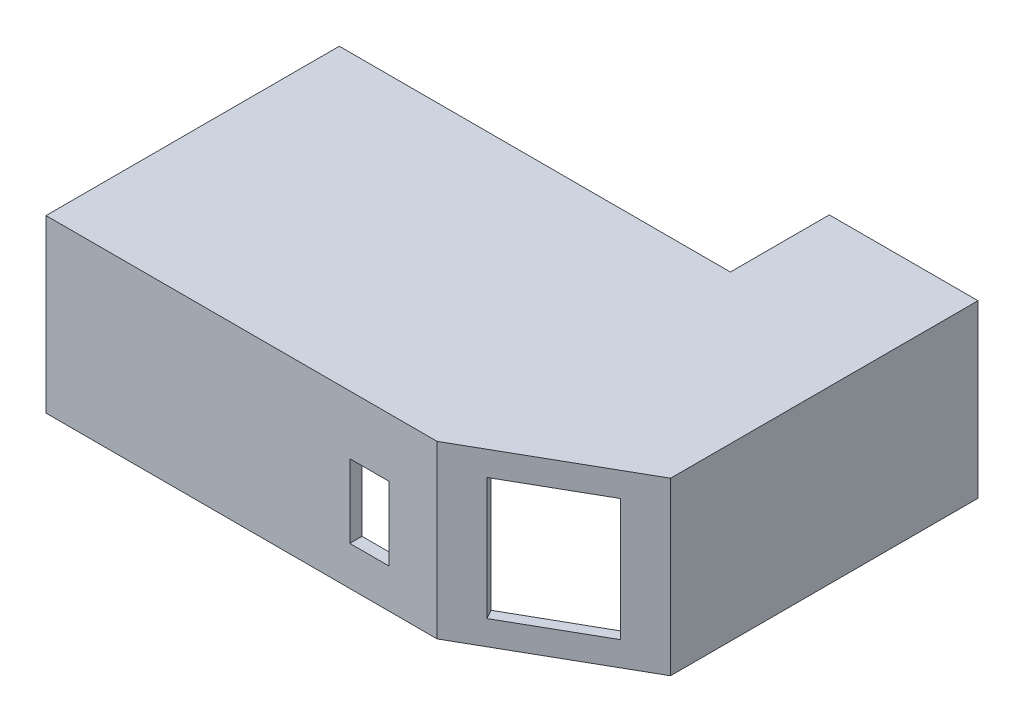
ISO-10303-21;
HEADER;
FILE_DESCRIPTION(('STEP AP214'),'2;1');
FILE_NAME('part.step','',(''),(''),'','','');
FILE_SCHEMA(('AUTOMOTIVE_DESIGN { 1 0 10303 214 1 1 1 1 }'));
ENDSEC;
DATA;
#1=APPLICATION_CONTEXT('core data for automotive mechanical design processes');
#2=APPLICATION_PROTOCOL_DEFINITION('international standard','automotive_design',2000,#1);
#3=PRODUCT_CONTEXT('',#1,'mechanical');
#4=PRODUCT('Part','Part','',(#3));
#5=PRODUCT_RELATED_PRODUCT_CATEGORY('part','',(#4));
#6=PRODUCT_DEFINITION_FORMATION('','',#4);
#7=PRODUCT_DEFINITION_CONTEXT('part definition',#1,'design');
#8=PRODUCT_DEFINITION('design','',#6,#7);
#9=PRODUCT_DEFINITION_SHAPE('','',#8);
#10=(LENGTH_UNIT() NAMED_UNIT(*) SI_UNIT(.MILLI.,.METRE.));
#11=(NAMED_UNIT(*) PLANE_ANGLE_UNIT() SI_UNIT($,.RADIAN.));
#12=(NAMED_UNIT(*) SI_UNIT($,.STERADIAN.) SOLID_ANGLE_UNIT());
#13=UNCERTAINTY_MEASURE_WITH_UNIT(LENGTH_MEASURE(1.E-05),#10,'distance_accuracy_value','');
#14=(GEOMETRIC_REPRESENTATION_CONTEXT(3) GLOBAL_UNCERTAINTY_ASSIGNED_CONTEXT((#13)) GLOBAL_UNIT_ASSIGNED_CONTEXT((#10,
#11,#12)) REPRESENTATION_CONTEXT('',''));
#15=CARTESIAN_POINT('',(0.,0.,0.));
#16=DIRECTION('',(0.,0.,1.));
#17=DIRECTION('',(1.,0.,0.));
#18=AXIS2_PLACEMENT_3D('',#15,#16,#17);
#19=CARTESIAN_POINT('',(0.,35.,0.));
#20=DIRECTION('',(1.,0.,0.));
#21=DIRECTION('',(0.,0.,-1.));
#22=AXIS2_PLACEMENT_3D('',#19,#20,#21);
#23=PLANE('',#22);
#24=DIRECTION('',(0.,0.,1.));
#25=VECTOR('',#24,1.);
#26=CARTESIAN_POINT('',(0.,0.,0.));
#27=LINE('',#26,#25);
#28=CARTESIAN_POINT('',(0.,0.,-60.));
#29=VERTEX_POINT('',#28);
#30=CARTESIAN_POINT('',(0.,0.,0.));
#31=VERTEX_POINT('',#30);
#32=EDGE_CURVE('E308',#29,#31,#27,.T.);
#33=ORIENTED_EDGE('',*,*,#32,.T.);
#34=DIRECTION('',(0.,-1.,0.));
#35=VECTOR('',#34,1.);
#36=CARTESIAN_POINT('',(0.,35.,0.));
#37=LINE('',#36,#35);
#38=CARTESIAN_POINT('',(0.,35.,0.));
#39=VERTEX_POINT('',#38);
#40=EDGE_CURVE('E395',#39,#31,#37,.T.);
#41=ORIENTED_EDGE('',*,*,#40,.F.);
#42=DIRECTION('',(0.,0.,1.));
#43=VECTOR('',#42,1.);
#44=CARTESIAN_POINT('',(0.,35.,0.));
#45=LINE('',#44,#43);
#46=CARTESIAN_POINT('',(0.,35.,-60.));
#47=VERTEX_POINT('',#46);
#48=EDGE_CURVE('E327',#47,#39,#45,.T.);
#49=ORIENTED_EDGE('',*,*,#48,.F.);
#50=DIRECTION('',(0.,-1.,0.));
#51=VECTOR('',#50,1.);
#52=CARTESIAN_POINT('',(0.,35.,-60.));
#53=LINE('',#52,#51);
#54=EDGE_CURVE('E350',#47,#29,#53,.T.);
#55=ORIENTED_EDGE('',*,*,#54,.T.);
#56=EDGE_LOOP('',(#33,#41,#49,#55));
#57=FACE_BOUND('',#56,.T.);
#58=ADVANCED_FACE('F38',(#57),#23,.F.);
#59=CARTESIAN_POINT('',(0.,35.,0.));
#60=DIRECTION('',(0.,0.,-1.));
#61=DIRECTION('',(-1.,0.,0.));
#62=AXIS2_PLACEMENT_3D('',#59,#60,#61);
#63=PLANE('',#62);
#64=DIRECTION('',(1.,0.,0.));
#65=VECTOR('',#64,1.);
#66=CARTESIAN_POINT('',(62.1548724958976,8.,0.));
#67=LINE('',#66,#65);
#68=CARTESIAN_POINT('',(62.1548724958976,8.,0.));
#69=VERTEX_POINT('',#68);
#70=CARTESIAN_POINT('',(70.1548724958976,8.,0.));
#71=VERTEX_POINT('',#70);
#72=EDGE_CURVE('E199',#69,#71,#67,.T.);
#73=ORIENTED_EDGE('',*,*,#72,.F.);
#74=DIRECTION('',(0.,-1.,0.));
#75=VECTOR('',#74,1.);
#76=CARTESIAN_POINT('',(62.1548724958976,23.,0.));
#77=LINE('',#76,#75);
#78=CARTESIAN_POINT('',(62.1548724958976,23.,0.));
#79=VERTEX_POINT('',#78);
#80=EDGE_CURVE('E53',#79,#69,#77,.T.);
#81=ORIENTED_EDGE('',*,*,#80,.F.);
#82=DIRECTION('',(-1.,0.,0.));
#83=VECTOR('',#82,1.);
#84=CARTESIAN_POINT('',(62.1548724958976,23.,0.));
#85=LINE('',#84,#83);
#86=CARTESIAN_POINT('',(70.1548724958976,23.,0.));
#87=VERTEX_POINT('',#86);
#88=EDGE_CURVE('E207',#87,#79,#85,.T.);
#89=ORIENTED_EDGE('',*,*,#88,.F.);
#90=DIRECTION('',(0.,1.,0.));
#91=VECTOR('',#90,1.);
#92=CARTESIAN_POINT('',(70.1548724958976,23.,0.));
#93=LINE('',#92,#91);
#94=EDGE_CURVE('E189',#71,#87,#93,.T.);
#95=ORIENTED_EDGE('',*,*,#94,.F.);
#96=EDGE_LOOP('',(#73,#81,#89,#95));
#97=FACE_BOUND('',#96,.T.);
#98=DIRECTION('',(1.,0.,0.));
#99=VECTOR('',#98,1.);
#100=CARTESIAN_POINT('',(0.,0.,0.));
#101=LINE('',#100,#99);
#102=CARTESIAN_POINT('',(80.,0.,0.));
#103=VERTEX_POINT('',#102);
#104=EDGE_CURVE('E354',#31,#103,#101,.T.);
#105=ORIENTED_EDGE('',*,*,#104,.T.);
#106=DIRECTION('',(0.,-1.,0.));
#107=VECTOR('',#106,1.);
#108=CARTESIAN_POINT('',(80.,35.,0.));
#109=LINE('',#108,#107);
#110=CARTESIAN_POINT('',(80.,35.,0.));
#111=VERTEX_POINT('',#110);
#112=EDGE_CURVE('E391',#111,#103,#109,.T.);
#113=ORIENTED_EDGE('',*,*,#112,.F.);
#114=DIRECTION('',(1.,0.,0.));
#115=VECTOR('',#114,1.);
#116=CARTESIAN_POINT('',(0.,35.,0.));
#117=LINE('',#116,#115);
#118=EDGE_CURVE('E331',#39,#111,#117,.T.);
#119=ORIENTED_EDGE('',*,*,#118,.F.);
#120=ORIENTED_EDGE('',*,*,#40,.T.);
#121=EDGE_LOOP('',(#105,#113,#119,#120));
#122=FACE_BOUND('',#121,.T.);
#123=ADVANCED_FACE('F204',(#97,#122),#63,.F.);
#124=CARTESIAN_POINT('',(80.,35.,0.));
#125=DIRECTION('',(-0.495479383518765,0.,-0.868619698434168));
#126=DIRECTION('',(-0.868619698434168,0.,0.495479383518765));
#127=AXIS2_PLACEMENT_3D('',#124,#125,#126);
#128=PLANE('',#127);
#129=DIRECTION('',(0.868619698434168,0.,-0.495479383518765));
#130=VECTOR('',#129,1.);
#131=CARTESIAN_POINT('',(86.5146477382563,5.,-3.71609537639075));
#132=LINE('',#131,#130);
#133=CARTESIAN_POINT('',(86.5146477382563,5.,-3.71609537639075));
#134=VERTEX_POINT('',#133);
#135=CARTESIAN_POINT('',(103.88704170694,5.,-13.625683046766));
#136=VERTEX_POINT('',#135);
#137=EDGE_CURVE('E229',#134,#136,#132,.T.);
#138=ORIENTED_EDGE('',*,*,#137,.F.);
#139=DIRECTION('',(0.,-1.,0.));
#140=VECTOR('',#139,1.);
#141=CARTESIAN_POINT('',(86.5146477382563,30.,-3.71609537639074));
#142=LINE('',#141,#140);
#143=CARTESIAN_POINT('',(86.5146477382563,30.,-3.71609537639074));
#144=VERTEX_POINT('',#143);
#145=EDGE_CURVE('E226',#144,#134,#142,.T.);
#146=ORIENTED_EDGE('',*,*,#145,.F.);
#147=DIRECTION('',(-0.868619698434168,0.,0.495479383518765));
#148=VECTOR('',#147,1.);
#149=CARTESIAN_POINT('',(86.5146477382563,30.,-3.71609537639074));
#150=LINE('',#149,#148);
#151=CARTESIAN_POINT('',(103.88704170694,30.,-13.625683046766));
#152=VERTEX_POINT('',#151);
#153=EDGE_CURVE('E237',#152,#144,#150,.T.);
#154=ORIENTED_EDGE('',*,*,#153,.F.);
#155=DIRECTION('',(0.,1.,0.));
#156=VECTOR('',#155,1.);
#157=CARTESIAN_POINT('',(103.88704170694,30.,-13.625683046766));
#158=LINE('',#157,#156);
#159=EDGE_CURVE('E233',#136,#152,#158,.T.);
#160=ORIENTED_EDGE('',*,*,#159,.F.);
#161=EDGE_LOOP('',(#138,#146,#154,#160));
#162=FACE_BOUND('',#161,.T.);
#163=DIRECTION('',(0.868619698434168,0.,-0.495479383518765));
#164=VECTOR('',#163,1.);
#165=CARTESIAN_POINT('',(80.,0.,0.));
#166=LINE('',#165,#164);
#167=CARTESIAN_POINT('',(110.413987200093,0.,-17.348793327408));
#168=VERTEX_POINT('',#167);
#169=EDGE_CURVE('E357',#103,#168,#166,.T.);
#170=ORIENTED_EDGE('',*,*,#169,.T.);
#171=DIRECTION('',(0.,-1.,0.));
#172=VECTOR('',#171,1.);
#173=CARTESIAN_POINT('',(110.413987200093,35.,-17.348793327408));
#174=LINE('',#173,#172);
#175=CARTESIAN_POINT('',(110.413987200093,35.,-17.348793327408));
#176=VERTEX_POINT('',#175);
#177=EDGE_CURVE('E387',#176,#168,#174,.T.);
#178=ORIENTED_EDGE('',*,*,#177,.F.);
#179=DIRECTION('',(0.868619698434168,0.,-0.495479383518765));
#180=VECTOR('',#179,1.);
#181=CARTESIAN_POINT('',(80.,35.,0.));
#182=LINE('',#181,#180);
#183=EDGE_CURVE('E335',#111,#176,#182,.T.);
#184=ORIENTED_EDGE('',*,*,#183,.F.);
#185=ORIENTED_EDGE('',*,*,#112,.T.);
#186=EDGE_LOOP('',(#170,#178,#184,#185));
#187=FACE_BOUND('',#186,.T.);
#188=ADVANCED_FACE('F447',(#162,#187),#128,.F.);
#189=CARTESIAN_POINT('',(110.413987200093,35.,-60.));
#190=DIRECTION('',(-1.,0.,0.));
#191=DIRECTION('',(0.,0.,1.));
#192=AXIS2_PLACEMENT_3D('',#189,#190,#191);
#193=PLANE('',#192);
#194=DIRECTION('',(0.,0.,-1.));
#195=VECTOR('',#194,1.);
#196=CARTESIAN_POINT('',(110.413987200093,0.,-60.));
#197=LINE('',#196,#195);
#198=CARTESIAN_POINT('',(110.413987200093,0.,-80.2410231425809));
#199=VERTEX_POINT('',#198);
#200=EDGE_CURVE('E361',#168,#199,#197,.T.);
#201=ORIENTED_EDGE('',*,*,#200,.T.);
#202=DIRECTION('',(0.,-1.,0.));
#203=VECTOR('',#202,1.);
#204=CARTESIAN_POINT('',(110.413987200093,35.,-80.2410231425809));
#205=LINE('',#204,#203);
#206=CARTESIAN_POINT('',(110.413987200093,35.,-80.2410231425809));
#207=VERTEX_POINT('',#206);
#208=EDGE_CURVE('E383',#207,#199,#205,.T.);
#209=ORIENTED_EDGE('',*,*,#208,.F.);
#210=DIRECTION('',(0.,0.,-1.));
#211=VECTOR('',#210,1.);
#212=CARTESIAN_POINT('',(110.413987200093,35.,-17.348793327408));
#213=LINE('',#212,#211);
#214=EDGE_CURVE('E338',#176,#207,#213,.T.);
#215=ORIENTED_EDGE('',*,*,#214,.F.);
#216=ORIENTED_EDGE('',*,*,#177,.T.);
#217=EDGE_LOOP('',(#201,#209,#215,#216));
#218=FACE_BOUND('',#217,.T.);
#219=ADVANCED_FACE('F476',(#218),#193,.F.);
#220=CARTESIAN_POINT('',(110.413987200093,35.,-80.2410231425809));
#221=DIRECTION('',(0.,0.,1.));
#222=DIRECTION('',(1.,0.,0.));
#223=AXIS2_PLACEMENT_3D('',#220,#221,#222);
#224=PLANE('',#223);
#225=CARTESIAN_POINT('',(97.4139872000932,17.5,-80.2410231425809));
#226=DIRECTION('',(0.,0.,-1.));
#227=DIRECTION('',(-1.,0.,0.));
#228=AXIS2_PLACEMENT_3D('',#225,#226,#227);
#229=CIRCLE('',#228,3.50000000000001);
#230=CARTESIAN_POINT('',(93.9139872000932,17.5,-80.2410231425809));
#231=VERTEX_POINT('',#230);
#232=EDGE_CURVE('E217',#231,#231,#229,.T.);
#233=ORIENTED_EDGE('',*,*,#232,.F.);
#234=EDGE_LOOP('',(#233));
#235=FACE_BOUND('',#234,.T.);
#236=DIRECTION('',(-1.,0.,0.));
#237=VECTOR('',#236,1.);
#238=CARTESIAN_POINT('',(110.413987200093,0.,-80.2410231425809));
#239=LINE('',#238,#237);
#240=CARTESIAN_POINT('',(80.,0.,-80.2410231425809));
#241=VERTEX_POINT('',#240);
#242=EDGE_CURVE('E364',#199,#241,#239,.T.);
#243=ORIENTED_EDGE('',*,*,#242,.T.);
#244=DIRECTION('',(0.,-1.,0.));
#245=VECTOR('',#244,1.);
#246=CARTESIAN_POINT('',(80.,35.,-80.2410231425809));
#247=LINE('',#246,#245);
#248=CARTESIAN_POINT('',(80.,35.,-80.2410231425809));
#249=VERTEX_POINT('',#248);
#250=EDGE_CURVE('E379',#249,#241,#247,.T.);
#251=ORIENTED_EDGE('',*,*,#250,.F.);
#252=DIRECTION('',(-1.,0.,0.));
#253=VECTOR('',#252,1.);
#254=CARTESIAN_POINT('',(110.413987200093,35.,-80.2410231425809));
#255=LINE('',#254,#253);
#256=EDGE_CURVE('E341',#207,#249,#255,.T.);
#257=ORIENTED_EDGE('',*,*,#256,.F.);
#258=ORIENTED_EDGE('',*,*,#208,.T.);
#259=EDGE_LOOP('',(#243,#251,#257,#258));
#260=FACE_BOUND('',#259,.T.);
#261=ADVANCED_FACE('F471',(#235,#260),#224,.F.);
#262=CARTESIAN_POINT('',(80.,35.,-80.2410231425809));
#263=DIRECTION('',(1.,0.,0.));
#264=DIRECTION('',(0.,0.,-1.));
#265=AXIS2_PLACEMENT_3D('',#262,#263,#264);
#266=PLANE('',#265);
#267=DIRECTION('',(0.,0.,1.));
#268=VECTOR('',#267,1.);
#269=CARTESIAN_POINT('',(80.,0.,-80.2410231425809));
#270=LINE('',#269,#268);
#271=CARTESIAN_POINT('',(80.,0.,-60.));
#272=VERTEX_POINT('',#271);
#273=EDGE_CURVE('E367',#241,#272,#270,.T.);
#274=ORIENTED_EDGE('',*,*,#273,.T.);
#275=DIRECTION('',(0.,-1.,0.));
#276=VECTOR('',#275,1.);
#277=CARTESIAN_POINT('',(80.,35.,-60.));
#278=LINE('',#277,#276);
#279=CARTESIAN_POINT('',(80.,35.,-60.));
#280=VERTEX_POINT('',#279);
#281=EDGE_CURVE('E375',#280,#272,#278,.T.);
#282=ORIENTED_EDGE('',*,*,#281,.F.);
#283=DIRECTION('',(0.,0.,1.));
#284=VECTOR('',#283,1.);
#285=CARTESIAN_POINT('',(80.,35.,-80.2410231425809));
#286=LINE('',#285,#284);
#287=EDGE_CURVE('E344',#249,#280,#286,.T.);
#288=ORIENTED_EDGE('',*,*,#287,.F.);
#289=ORIENTED_EDGE('',*,*,#250,.T.);
#290=EDGE_LOOP('',(#274,#282,#288,#289));
#291=FACE_BOUND('',#290,.T.);
#292=ADVANCED_FACE('F467',(#291),#266,.F.);
#293=CARTESIAN_POINT('',(0.,35.,-60.));
#294=DIRECTION('',(0.,0.,1.));
#295=DIRECTION('',(1.,0.,0.));
#296=AXIS2_PLACEMENT_3D('',#293,#294,#295);
#297=PLANE('',#296);
#298=DIRECTION('',(-1.,0.,0.));
#299=VECTOR('',#298,1.);
#300=CARTESIAN_POINT('',(0.,0.,-60.));
#301=LINE('',#300,#299);
#302=EDGE_CURVE('E332',#272,#29,#301,.T.);
#303=ORIENTED_EDGE('',*,*,#302,.T.);
#304=ORIENTED_EDGE('',*,*,#54,.F.);
#305=DIRECTION('',(-1.,0.,0.));
#306=VECTOR('',#305,1.);
#307=CARTESIAN_POINT('',(0.,35.,-60.));
#308=LINE('',#307,#306);
#309=EDGE_CURVE('E347',#280,#47,#308,.T.);
#310=ORIENTED_EDGE('',*,*,#309,.F.);
#311=ORIENTED_EDGE('',*,*,#281,.T.);
#312=EDGE_LOOP('',(#303,#304,#310,#311));
#313=FACE_BOUND('',#312,.T.);
#314=ADVANCED_FACE('F465',(#313),#297,.F.);
#315=CARTESIAN_POINT('',(0.,35.,0.));
#316=DIRECTION('',(0.,-1.,0.));
#317=DIRECTION('',(0.,0.,-1.));
#318=AXIS2_PLACEMENT_3D('',#315,#316,#317);
#319=PLANE('',#318);
#320=ORIENTED_EDGE('',*,*,#48,.T.);
#321=ORIENTED_EDGE('',*,*,#118,.T.);
#322=ORIENTED_EDGE('',*,*,#183,.T.);
#323=ORIENTED_EDGE('',*,*,#214,.T.);
#324=ORIENTED_EDGE('',*,*,#256,.T.);
#325=ORIENTED_EDGE('',*,*,#287,.T.);
#326=ORIENTED_EDGE('',*,*,#309,.T.);
#327=EDGE_LOOP('',(#320,#321,#322,#323,#324,#325,#326));
#328=FACE_BOUND('',#327,.T.);
#329=ADVANCED_FACE('F460',(#328),#319,.F.);
#330=CARTESIAN_POINT('',(0.,0.,0.));
#331=DIRECTION('',(0.,-1.,0.));
#332=DIRECTION('',(0.,0.,-1.));
#333=AXIS2_PLACEMENT_3D('',#330,#331,#332);
#334=PLANE('',#333);
#335=DIRECTION('',(0.,0.,-1.));
#336=VECTOR('',#335,1.);
#337=CARTESIAN_POINT('',(2.5,0.,-2.5));
#338=LINE('',#337,#336);
#339=CARTESIAN_POINT('',(2.5,0.,-2.5));
#340=VERTEX_POINT('',#339);
#341=CARTESIAN_POINT('',(2.5,0.,-57.5));
#342=VERTEX_POINT('',#341);
#343=EDGE_CURVE('E245',#340,#342,#338,.T.);
#344=ORIENTED_EDGE('',*,*,#343,.F.);
#345=DIRECTION('',(1.,0.,0.));
#346=VECTOR('',#345,1.);
#347=CARTESIAN_POINT('',(2.5,0.,-2.5));
#348=LINE('',#347,#346);
#349=CARTESIAN_POINT('',(80.,0.,-2.49999999999999));
#350=VERTEX_POINT('',#349);
#351=EDGE_CURVE('E260',#340,#350,#348,.T.);
#352=ORIENTED_EDGE('',*,*,#351,.T.);
#353=DIRECTION('',(0.869644648573949,0.,-0.493678220308222));
#354=VECTOR('',#353,1.);
#355=CARTESIAN_POINT('',(80.,0.,-2.49999999999999));
#356=LINE('',#355,#354);
#357=CARTESIAN_POINT('',(107.913987200093,0.,-18.346159170008));
#358=VERTEX_POINT('',#357);
#359=EDGE_CURVE('E298',#350,#358,#356,.T.);
#360=ORIENTED_EDGE('',*,*,#359,.T.);
#361=DIRECTION('',(0.,0.,-1.));
#362=VECTOR('',#361,1.);
#363=CARTESIAN_POINT('',(107.913987200093,0.,-18.346159170008));
#364=LINE('',#363,#362);
#365=CARTESIAN_POINT('',(107.913987200093,0.,-77.7410231425809));
#366=VERTEX_POINT('',#365);
#367=EDGE_CURVE('E294',#358,#366,#364,.T.);
#368=ORIENTED_EDGE('',*,*,#367,.T.);
#369=DIRECTION('',(-1.,0.,0.));
#370=VECTOR('',#369,1.);
#371=CARTESIAN_POINT('',(107.913987200093,0.,-77.7410231425809));
#372=LINE('',#371,#370);
#373=CARTESIAN_POINT('',(82.5,0.,-77.7410231425809));
#374=VERTEX_POINT('',#373);
#375=EDGE_CURVE('E290',#366,#374,#372,.T.);
#376=ORIENTED_EDGE('',*,*,#375,.T.);
#377=DIRECTION('',(0.,0.,1.));
#378=VECTOR('',#377,1.);
#379=CARTESIAN_POINT('',(82.5,0.,-77.7410231425809));
#380=LINE('',#379,#378);
#381=CARTESIAN_POINT('',(82.5,0.,-57.5));
#382=VERTEX_POINT('',#381);
#383=EDGE_CURVE('E286',#374,#382,#380,.T.);
#384=ORIENTED_EDGE('',*,*,#383,.T.);
#385=DIRECTION('',(-1.,0.,0.));
#386=VECTOR('',#385,1.);
#387=CARTESIAN_POINT('',(82.5,0.,-57.5));
#388=LINE('',#387,#386);
#389=EDGE_CURVE('E282',#382,#342,#388,.T.);
#390=ORIENTED_EDGE('',*,*,#389,.T.);
#391=EDGE_LOOP('',(#344,#352,#360,#368,#376,#384,#390));
#392=FACE_BOUND('',#391,.T.);
#393=ORIENTED_EDGE('',*,*,#32,.F.);
#394=ORIENTED_EDGE('',*,*,#302,.F.);
#395=ORIENTED_EDGE('',*,*,#273,.F.);
#396=ORIENTED_EDGE('',*,*,#242,.F.);
#397=ORIENTED_EDGE('',*,*,#200,.F.);
#398=ORIENTED_EDGE('',*,*,#169,.F.);
#399=ORIENTED_EDGE('',*,*,#104,.F.);
#400=EDGE_LOOP('',(#393,#394,#395,#396,#397,#398,#399));
#401=FACE_BOUND('',#400,.T.);
#402=ADVANCED_FACE('F454',(#392,#401),#334,.T.);
#403=CARTESIAN_POINT('',(2.5,32.5,-2.5));
#404=DIRECTION('',(-1.,0.,0.));
#405=DIRECTION('',(0.,0.,1.));
#406=AXIS2_PLACEMENT_3D('',#403,#404,#405);
#407=PLANE('',#406);
#408=ORIENTED_EDGE('',*,*,#343,.T.);
#409=DIRECTION('',(0.,-1.,0.));
#410=VECTOR('',#409,1.);
#411=CARTESIAN_POINT('',(2.5,32.5,-57.5));
#412=LINE('',#411,#410);
#413=CARTESIAN_POINT('',(2.5,32.5,-57.5));
#414=VERTEX_POINT('',#413);
#415=EDGE_CURVE('E279',#414,#342,#412,.T.);
#416=ORIENTED_EDGE('',*,*,#415,.F.);
#417=DIRECTION('',(0.,0.,-1.));
#418=VECTOR('',#417,1.);
#419=CARTESIAN_POINT('',(2.5,32.5,-2.5));
#420=LINE('',#419,#418);
#421=CARTESIAN_POINT('',(2.5,32.5,-2.5));
#422=VERTEX_POINT('',#421);
#423=EDGE_CURVE('E255',#422,#414,#420,.T.);
#424=ORIENTED_EDGE('',*,*,#423,.F.);
#425=DIRECTION('',(0.,-1.,0.));
#426=VECTOR('',#425,1.);
#427=CARTESIAN_POINT('',(2.5,32.5,-2.5));
#428=LINE('',#427,#426);
#429=EDGE_CURVE('E305',#422,#340,#428,.T.);
#430=ORIENTED_EDGE('',*,*,#429,.T.);
#431=EDGE_LOOP('',(#408,#416,#424,#430));
#432=FACE_BOUND('',#431,.T.);
#433=ADVANCED_FACE('F497',(#432),#407,.F.);
#434=CARTESIAN_POINT('',(2.5,32.5,-2.5));
#435=DIRECTION('',(0.,0.,-1.));
#436=DIRECTION('',(-1.,0.,0.));
#437=AXIS2_PLACEMENT_3D('',#434,#435,#436);
#438=PLANE('',#437);
#439=DIRECTION('',(0.,1.,0.));
#440=VECTOR('',#439,1.);
#441=CARTESIAN_POINT('',(62.1548724958976,32.5,-2.49999999999999));
#442=LINE('',#441,#440);
#443=CARTESIAN_POINT('',(62.1548724958976,8.,-2.5));
#444=VERTEX_POINT('',#443);
#445=CARTESIAN_POINT('',(62.1548724958976,23.,-2.5));
#446=VERTEX_POINT('',#445);
#447=EDGE_CURVE('E11',#444,#446,#442,.T.);
#448=ORIENTED_EDGE('',*,*,#447,.F.);
#449=DIRECTION('',(-1.,0.,0.));
#450=VECTOR('',#449,1.);
#451=CARTESIAN_POINT('',(2.5,8.,-2.5));
#452=LINE('',#451,#450);
#453=CARTESIAN_POINT('',(70.1548724958976,8.,-2.49999999999999));
#454=VERTEX_POINT('',#453);
#455=EDGE_CURVE('E412',#454,#444,#452,.T.);
#456=ORIENTED_EDGE('',*,*,#455,.F.);
#457=DIRECTION('',(0.,-1.,0.));
#458=VECTOR('',#457,1.);
#459=CARTESIAN_POINT('',(70.1548724958976,32.5,-2.49999999999999));
#460=LINE('',#459,#458);
#461=CARTESIAN_POINT('',(70.1548724958976,23.,-2.5));
#462=VERTEX_POINT('',#461);
#463=EDGE_CURVE('E192',#462,#454,#460,.T.);
#464=ORIENTED_EDGE('',*,*,#463,.F.);
#465=DIRECTION('',(1.,0.,0.));
#466=VECTOR('',#465,1.);
#467=CARTESIAN_POINT('',(2.5,23.,-2.5));
#468=LINE('',#467,#466);
#469=EDGE_CURVE('E46',#446,#462,#468,.T.);
#470=ORIENTED_EDGE('',*,*,#469,.F.);
#471=EDGE_LOOP('',(#448,#456,#464,#470));
#472=FACE_BOUND('',#471,.T.);
#473=ORIENTED_EDGE('',*,*,#351,.F.);
#474=ORIENTED_EDGE('',*,*,#429,.F.);
#475=DIRECTION('',(1.,0.,0.));
#476=VECTOR('',#475,1.);
#477=CARTESIAN_POINT('',(2.5,32.5,-2.5));
#478=LINE('',#477,#476);
#479=CARTESIAN_POINT('',(80.,32.5,-2.49999999999999));
#480=VERTEX_POINT('',#479);
#481=EDGE_CURVE('E276',#422,#480,#478,.T.);
#482=ORIENTED_EDGE('',*,*,#481,.T.);
#483=DIRECTION('',(0.,-1.,0.));
#484=VECTOR('',#483,1.);
#485=CARTESIAN_POINT('',(80.,32.5,-2.49999999999999));
#486=LINE('',#485,#484);
#487=EDGE_CURVE('E309',#480,#350,#486,.T.);
#488=ORIENTED_EDGE('',*,*,#487,.T.);
#489=EDGE_LOOP('',(#473,#474,#482,#488));
#490=FACE_BOUND('',#489,.T.);
#491=ADVANCED_FACE('F426',(#472,#490),#438,.T.);
#492=CARTESIAN_POINT('',(80.,32.5,-2.49999999999999));
#493=DIRECTION('',(-0.493678220308222,0.,-0.869644648573949));
#494=DIRECTION('',(-0.869644648573949,0.,0.493678220308222));
#495=AXIS2_PLACEMENT_3D('',#492,#493,#494);
#496=PLANE('',#495);
#497=DIRECTION('',(0.,1.,0.));
#498=VECTOR('',#497,1.);
#499=CARTESIAN_POINT('',(85.4451190710234,32.5,-5.5910748393119));
#500=LINE('',#499,#498);
#501=CARTESIAN_POINT('',(85.4451190710234,5.,-5.5910748393119));
#502=VERTEX_POINT('',#501);
#503=CARTESIAN_POINT('',(85.4451190710234,30.,-5.5910748393119));
#504=VERTEX_POINT('',#503);
#505=EDGE_CURVE('E409',#502,#504,#500,.T.);
#506=ORIENTED_EDGE('',*,*,#505,.F.);
#507=DIRECTION('',(-0.869644648573949,0.,0.493678220308222));
#508=VECTOR('',#507,1.);
#509=CARTESIAN_POINT('',(80.,5.,-2.49999999999999));
#510=LINE('',#509,#508);
#511=CARTESIAN_POINT('',(102.838049391313,5.,-15.4646604475782));
#512=VERTEX_POINT('',#511);
#513=EDGE_CURVE('E399',#512,#502,#510,.T.);
#514=ORIENTED_EDGE('',*,*,#513,.F.);
#515=DIRECTION('',(0.,-1.,0.));
#516=VECTOR('',#515,1.);
#517=CARTESIAN_POINT('',(102.838049391313,32.5,-15.4646604475782));
#518=LINE('',#517,#516);
#519=CARTESIAN_POINT('',(102.838049391313,30.,-15.4646604475782));
#520=VERTEX_POINT('',#519);
#521=EDGE_CURVE('E402',#520,#512,#518,.T.);
#522=ORIENTED_EDGE('',*,*,#521,.F.);
#523=DIRECTION('',(0.869644648573949,0.,-0.493678220308222));
#524=VECTOR('',#523,1.);
#525=CARTESIAN_POINT('',(80.,30.,-2.49999999999999));
#526=LINE('',#525,#524);
#527=EDGE_CURVE('E406',#504,#520,#526,.T.);
#528=ORIENTED_EDGE('',*,*,#527,.F.);
#529=EDGE_LOOP('',(#506,#514,#522,#528));
#530=FACE_BOUND('',#529,.T.);
#531=ORIENTED_EDGE('',*,*,#359,.F.);
#532=ORIENTED_EDGE('',*,*,#487,.F.);
#533=DIRECTION('',(0.869644648573949,0.,-0.493678220308222));
#534=VECTOR('',#533,1.);
#535=CARTESIAN_POINT('',(80.,32.5,-2.49999999999999));
#536=LINE('',#535,#534);
#537=CARTESIAN_POINT('',(107.913987200093,32.5,-18.346159170008));
#538=VERTEX_POINT('',#537);
#539=EDGE_CURVE('E273',#480,#538,#536,.T.);
#540=ORIENTED_EDGE('',*,*,#539,.T.);
#541=DIRECTION('',(0.,-1.,0.));
#542=VECTOR('',#541,1.);
#543=CARTESIAN_POINT('',(107.913987200093,32.5,-18.346159170008));
#544=LINE('',#543,#542);
#545=EDGE_CURVE('E312',#538,#358,#544,.T.);
#546=ORIENTED_EDGE('',*,*,#545,.T.);
#547=EDGE_LOOP('',(#531,#532,#540,#546));
#548=FACE_BOUND('',#547,.T.);
#549=ADVANCED_FACE('F520',(#530,#548),#496,.T.);
#550=CARTESIAN_POINT('',(107.913987200093,32.5,-18.346159170008));
#551=DIRECTION('',(-1.,0.,0.));
#552=DIRECTION('',(0.,0.,1.));
#553=AXIS2_PLACEMENT_3D('',#550,#551,#552);
#554=PLANE('',#553);
#555=ORIENTED_EDGE('',*,*,#367,.F.);
#556=ORIENTED_EDGE('',*,*,#545,.F.);
#557=DIRECTION('',(0.,0.,-1.));
#558=VECTOR('',#557,1.);
#559=CARTESIAN_POINT('',(107.913987200093,32.5,-18.346159170008));
#560=LINE('',#559,#558);
#561=CARTESIAN_POINT('',(107.913987200093,32.5,-77.7410231425809));
#562=VERTEX_POINT('',#561);
#563=EDGE_CURVE('E270',#538,#562,#560,.T.);
#564=ORIENTED_EDGE('',*,*,#563,.T.);
#565=DIRECTION('',(0.,-1.,0.));
#566=VECTOR('',#565,1.);
#567=CARTESIAN_POINT('',(107.913987200093,32.5,-77.7410231425809));
#568=LINE('',#567,#566);
#569=EDGE_CURVE('E315',#562,#366,#568,.T.);
#570=ORIENTED_EDGE('',*,*,#569,.T.);
#571=EDGE_LOOP('',(#555,#556,#564,#570));
#572=FACE_BOUND('',#571,.T.);
#573=ADVANCED_FACE('F516',(#572),#554,.T.);
#574=CARTESIAN_POINT('',(107.913987200093,32.5,-77.7410231425809));
#575=DIRECTION('',(0.,0.,1.));
#576=DIRECTION('',(1.,0.,0.));
#577=AXIS2_PLACEMENT_3D('',#574,#575,#576);
#578=PLANE('',#577);
#579=CARTESIAN_POINT('',(97.4139872000932,17.5,-77.7410231425809));
#580=DIRECTION('',(0.,0.,1.));
#581=DIRECTION('',(1.,0.,0.));
#582=AXIS2_PLACEMENT_3D('',#579,#580,#581);
#583=CIRCLE('',#582,3.50000000000001);
#584=CARTESIAN_POINT('',(93.9139872000932,17.5,-77.7410231425809));
#585=VERTEX_POINT('',#584);
#586=EDGE_CURVE('E225',#585,#585,#583,.T.);
#587=ORIENTED_EDGE('',*,*,#586,.F.);
#588=EDGE_LOOP('',(#587));
#589=FACE_BOUND('',#588,.T.);
#590=ORIENTED_EDGE('',*,*,#375,.F.);
#591=ORIENTED_EDGE('',*,*,#569,.F.);
#592=DIRECTION('',(-1.,0.,0.));
#593=VECTOR('',#592,1.);
#594=CARTESIAN_POINT('',(107.913987200093,32.5,-77.7410231425809));
#595=LINE('',#594,#593);
#596=CARTESIAN_POINT('',(82.5,32.5,-77.7410231425809));
#597=VERTEX_POINT('',#596);
#598=EDGE_CURVE('E267',#562,#597,#595,.T.);
#599=ORIENTED_EDGE('',*,*,#598,.T.);
#600=DIRECTION('',(0.,-1.,0.));
#601=VECTOR('',#600,1.);
#602=CARTESIAN_POINT('',(82.5,32.5,-77.7410231425809));
#603=LINE('',#602,#601);
#604=EDGE_CURVE('E318',#597,#374,#603,.T.);
#605=ORIENTED_EDGE('',*,*,#604,.T.);
#606=EDGE_LOOP('',(#590,#591,#599,#605));
#607=FACE_BOUND('',#606,.T.);
#608=ADVANCED_FACE('F512',(#589,#607),#578,.T.);
#609=CARTESIAN_POINT('',(82.5,32.5,-77.7410231425809));
#610=DIRECTION('',(1.,0.,0.));
#611=DIRECTION('',(0.,0.,-1.));
#612=AXIS2_PLACEMENT_3D('',#609,#610,#611);
#613=PLANE('',#612);
#614=ORIENTED_EDGE('',*,*,#383,.F.);
#615=ORIENTED_EDGE('',*,*,#604,.F.);
#616=DIRECTION('',(0.,0.,1.));
#617=VECTOR('',#616,1.);
#618=CARTESIAN_POINT('',(82.5,32.5,-77.7410231425809));
#619=LINE('',#618,#617);
#620=CARTESIAN_POINT('',(82.5,32.5,-57.5));
#621=VERTEX_POINT('',#620);
#622=EDGE_CURVE('E263',#597,#621,#619,.T.);
#623=ORIENTED_EDGE('',*,*,#622,.T.);
#624=DIRECTION('',(0.,-1.,0.));
#625=VECTOR('',#624,1.);
#626=CARTESIAN_POINT('',(82.5,32.5,-57.5));
#627=LINE('',#626,#625);
#628=EDGE_CURVE('E321',#621,#382,#627,.T.);
#629=ORIENTED_EDGE('',*,*,#628,.T.);
#630=EDGE_LOOP('',(#614,#615,#623,#629));
#631=FACE_BOUND('',#630,.T.);
#632=ADVANCED_FACE('F508',(#631),#613,.T.);
#633=CARTESIAN_POINT('',(82.5,32.5,-57.5));
#634=DIRECTION('',(0.,0.,1.));
#635=DIRECTION('',(1.,0.,0.));
#636=AXIS2_PLACEMENT_3D('',#633,#634,#635);
#637=PLANE('',#636);
#638=ORIENTED_EDGE('',*,*,#389,.F.);
#639=ORIENTED_EDGE('',*,*,#628,.F.);
#640=DIRECTION('',(1.,0.,0.));
#641=VECTOR('',#640,1.);
#642=CARTESIAN_POINT('',(2.5,32.5,-57.5));
#643=LINE('',#642,#641);
#644=EDGE_CURVE('E259',#414,#621,#643,.T.);
#645=ORIENTED_EDGE('',*,*,#644,.F.);
#646=ORIENTED_EDGE('',*,*,#415,.T.);
#647=EDGE_LOOP('',(#638,#639,#645,#646));
#648=FACE_BOUND('',#647,.T.);
#649=ADVANCED_FACE('F504',(#648),#637,.T.);
#650=CARTESIAN_POINT('',(0.,32.5,0.));
#651=DIRECTION('',(0.,-1.,0.));
#652=DIRECTION('',(0.,0.,-1.));
#653=AXIS2_PLACEMENT_3D('',#650,#651,#652);
#654=PLANE('',#653);
#655=ORIENTED_EDGE('',*,*,#423,.T.);
#656=ORIENTED_EDGE('',*,*,#644,.T.);
#657=ORIENTED_EDGE('',*,*,#622,.F.);
#658=ORIENTED_EDGE('',*,*,#598,.F.);
#659=ORIENTED_EDGE('',*,*,#563,.F.);
#660=ORIENTED_EDGE('',*,*,#539,.F.);
#661=ORIENTED_EDGE('',*,*,#481,.F.);
#662=EDGE_LOOP('',(#655,#656,#657,#658,#659,#660,#661));
#663=FACE_BOUND('',#662,.T.);
#664=ADVANCED_FACE('F507',(#663),#654,.T.);
#665=CARTESIAN_POINT('',(80.3211554442717,30.,-14.5738416068178));
#666=DIRECTION('',(-0.868619698434168,0.,0.495479383518765));
#667=DIRECTION('',(0.495479383518765,0.,0.868619698434168));
#668=AXIS2_PLACEMENT_3D('',#665,#666,#667);
#669=PLANE('',#668);
#670=ORIENTED_EDGE('',*,*,#505,.T.);
#671=DIRECTION('',(0.495479383518765,0.,0.868619698434168));
#672=VECTOR('',#671,1.);
#673=CARTESIAN_POINT('',(80.3211554442717,30.,-14.5738416068178));
#674=LINE('',#673,#672);
#675=EDGE_CURVE('E242',#504,#144,#674,.T.);
#676=ORIENTED_EDGE('',*,*,#675,.T.);
#677=ORIENTED_EDGE('',*,*,#145,.T.);
#678=DIRECTION('',(0.495479383518765,0.,0.868619698434168));
#679=VECTOR('',#678,1.);
#680=CARTESIAN_POINT('',(80.3211554442717,5.,-14.5738416068178));
#681=LINE('',#680,#679);
#682=EDGE_CURVE('E241',#502,#134,#681,.T.);
#683=ORIENTED_EDGE('',*,*,#682,.F.);
#684=EDGE_LOOP('',(#670,#676,#677,#683));
#685=FACE_BOUND('',#684,.T.);
#686=ADVANCED_FACE('F529',(#685),#669,.F.);
#687=CARTESIAN_POINT('',(80.3211554442717,30.,-14.5738416068178));
#688=DIRECTION('',(0.,1.,0.));
#689=DIRECTION('',(0.,0.,1.));
#690=AXIS2_PLACEMENT_3D('',#687,#688,#689);
#691=PLANE('',#690);
#692=ORIENTED_EDGE('',*,*,#527,.T.);
#693=DIRECTION('',(0.495479383518765,0.,0.868619698434168));
#694=VECTOR('',#693,1.);
#695=CARTESIAN_POINT('',(97.6935494129551,30.,-24.4834292771931));
#696=LINE('',#695,#694);
#697=EDGE_CURVE('E246',#520,#152,#696,.T.);
#698=ORIENTED_EDGE('',*,*,#697,.T.);
#699=ORIENTED_EDGE('',*,*,#153,.T.);
#700=ORIENTED_EDGE('',*,*,#675,.F.);
#701=EDGE_LOOP('',(#692,#698,#699,#700));
#702=FACE_BOUND('',#701,.T.);
#703=ADVANCED_FACE('F533',(#702),#691,.F.);
#704=CARTESIAN_POINT('',(97.6935494129551,30.,-24.4834292771931));
#705=DIRECTION('',(0.868619698434168,0.,-0.495479383518765));
#706=DIRECTION('',(-0.495479383518765,0.,-0.868619698434168));
#707=AXIS2_PLACEMENT_3D('',#704,#705,#706);
#708=PLANE('',#707);
#709=ORIENTED_EDGE('',*,*,#521,.T.);
#710=DIRECTION('',(0.495479383518765,0.,0.868619698434168));
#711=VECTOR('',#710,1.);
#712=CARTESIAN_POINT('',(97.6935494129551,5.,-24.4834292771931));
#713=LINE('',#712,#711);
#714=EDGE_CURVE('E249',#512,#136,#713,.T.);
#715=ORIENTED_EDGE('',*,*,#714,.T.);
#716=ORIENTED_EDGE('',*,*,#159,.T.);
#717=ORIENTED_EDGE('',*,*,#697,.F.);
#718=EDGE_LOOP('',(#709,#715,#716,#717));
#719=FACE_BOUND('',#718,.T.);
#720=ADVANCED_FACE('F537',(#719),#708,.F.);
#721=CARTESIAN_POINT('',(80.3211554442717,5.,-14.5738416068178));
#722=DIRECTION('',(0.,-1.,0.));
#723=DIRECTION('',(1.,0.,0.));
#724=AXIS2_PLACEMENT_3D('',#721,#722,#723);
#725=PLANE('',#724);
#726=ORIENTED_EDGE('',*,*,#513,.T.);
#727=ORIENTED_EDGE('',*,*,#682,.T.);
#728=ORIENTED_EDGE('',*,*,#137,.T.);
#729=ORIENTED_EDGE('',*,*,#714,.F.);
#730=EDGE_LOOP('',(#726,#727,#728,#729));
#731=FACE_BOUND('',#730,.T.);
#732=ADVANCED_FACE('F438',(#731),#725,.F.);
#733=CARTESIAN_POINT('',(97.4139872000932,17.5,-67.7410231425809));
#734=DIRECTION('',(0.,0.,-1.));
#735=DIRECTION('',(-1.,0.,0.));
#736=AXIS2_PLACEMENT_3D('',#733,#734,#735);
#737=CYLINDRICAL_SURFACE('',#736,3.50000000000001);
#738=CARTESIAN_POINT('',(93.9139872000932,17.5,-77.7410231425809));
#739=CARTESIAN_POINT('',(93.9139872000932,17.5,-77.7670648092476));
#740=CARTESIAN_POINT('',(93.9139872000932,17.5,-77.7931064759143));
#741=CARTESIAN_POINT('',(93.9139872000932,17.5,-77.8451898092476));
#742=CARTESIAN_POINT('',(93.9139872000932,17.5,-77.8712314759143));
#743=CARTESIAN_POINT('',(93.9139872000932,17.5,-77.9233148092476));
#744=CARTESIAN_POINT('',(93.9139872000932,17.5,-77.9493564759143));
#745=CARTESIAN_POINT('',(93.9139872000932,17.5,-78.0014398092476));
#746=CARTESIAN_POINT('',(93.9139872000932,17.5,-78.0274814759143));
#747=CARTESIAN_POINT('',(93.9139872000932,17.5,-78.0795648092476));
#748=CARTESIAN_POINT('',(93.9139872000932,17.5,-78.1056064759143));
#749=CARTESIAN_POINT('',(93.9139872000932,17.5,-78.1576898092476));
#750=CARTESIAN_POINT('',(93.9139872000932,17.5,-78.1837314759143));
#751=CARTESIAN_POINT('',(93.9139872000932,17.5,-78.2358148092476));
#752=CARTESIAN_POINT('',(93.9139872000932,17.5,-78.2618564759143));
#753=CARTESIAN_POINT('',(93.9139872000932,17.5,-78.3139398092476));
#754=CARTESIAN_POINT('',(93.9139872000932,17.5,-78.3399814759143));
#755=CARTESIAN_POINT('',(93.9139872000932,17.5,-78.3920648092476));
#756=CARTESIAN_POINT('',(93.9139872000932,17.5,-78.4181064759143));
#757=CARTESIAN_POINT('',(93.9139872000932,17.5,-78.4701898092476));
#758=CARTESIAN_POINT('',(93.9139872000932,17.5,-78.4962314759143));
#759=CARTESIAN_POINT('',(93.9139872000932,17.5,-78.5483148092476));
#760=CARTESIAN_POINT('',(93.9139872000932,17.5,-78.5743564759143));
#761=CARTESIAN_POINT('',(93.9139872000932,17.5,-78.6264398092476));
#762=CARTESIAN_POINT('',(93.9139872000932,17.5,-78.6524814759143));
#763=CARTESIAN_POINT('',(93.9139872000932,17.5,-78.7045648092476));
#764=CARTESIAN_POINT('',(93.9139872000932,17.5,-78.7306064759143));
#765=CARTESIAN_POINT('',(93.9139872000932,17.5,-78.7826898092476));
#766=CARTESIAN_POINT('',(93.9139872000932,17.5,-78.8087314759143));
#767=CARTESIAN_POINT('',(93.9139872000932,17.5,-78.8608148092476));
#768=CARTESIAN_POINT('',(93.9139872000932,17.5,-78.8868564759143));
#769=CARTESIAN_POINT('',(93.9139872000932,17.5,-78.9389398092476));
#770=CARTESIAN_POINT('',(93.9139872000932,17.5,-78.9649814759143));
#771=CARTESIAN_POINT('',(93.9139872000932,17.5,-79.0170648092476));
#772=CARTESIAN_POINT('',(93.9139872000932,17.5,-79.0431064759143));
#773=CARTESIAN_POINT('',(93.9139872000932,17.5,-79.0951898092476));
#774=CARTESIAN_POINT('',(93.9139872000932,17.5,-79.1212314759143));
#775=CARTESIAN_POINT('',(93.9139872000932,17.5,-79.1733148092476));
#776=CARTESIAN_POINT('',(93.9139872000932,17.5,-79.1993564759143));
#777=CARTESIAN_POINT('',(93.9139872000932,17.5,-79.2514398092476));
#778=CARTESIAN_POINT('',(93.9139872000932,17.5,-79.2774814759142));
#779=CARTESIAN_POINT('',(93.9139872000932,17.5,-79.3295648092476));
#780=CARTESIAN_POINT('',(93.9139872000932,17.5,-79.3556064759142));
#781=CARTESIAN_POINT('',(93.9139872000932,17.5,-79.4076898092476));
#782=CARTESIAN_POINT('',(93.9139872000932,17.5,-79.4337314759143));
#783=CARTESIAN_POINT('',(93.9139872000932,17.5,-79.4858148092476));
#784=CARTESIAN_POINT('',(93.9139872000932,17.5,-79.5118564759143));
#785=CARTESIAN_POINT('',(93.9139872000932,17.5,-79.5639398092476));
#786=CARTESIAN_POINT('',(93.9139872000932,17.5,-79.5899814759143));
#787=CARTESIAN_POINT('',(93.9139872000932,17.5,-79.6420648092476));
#788=CARTESIAN_POINT('',(93.9139872000932,17.5,-79.6681064759143));
#789=CARTESIAN_POINT('',(93.9139872000932,17.5,-79.7201898092476));
#790=CARTESIAN_POINT('',(93.9139872000932,17.5,-79.7462314759143));
#791=CARTESIAN_POINT('',(93.9139872000932,17.5,-79.7983148092476));
#792=CARTESIAN_POINT('',(93.9139872000932,17.5,-79.8243564759143));
#793=CARTESIAN_POINT('',(93.9139872000932,17.5,-79.8764398092476));
#794=CARTESIAN_POINT('',(93.9139872000932,17.5,-79.9024814759142));
#795=CARTESIAN_POINT('',(93.9139872000932,17.5,-79.9545648092476));
#796=CARTESIAN_POINT('',(93.9139872000932,17.5,-79.9806064759142));
#797=CARTESIAN_POINT('',(93.9139872000932,17.5,-80.0326898092476));
#798=CARTESIAN_POINT('',(93.9139872000932,17.5,-80.0587314759142));
#799=CARTESIAN_POINT('',(93.9139872000932,17.5,-80.1108148092476));
#800=CARTESIAN_POINT('',(93.9139872000932,17.5,-80.1368564759143));
#801=CARTESIAN_POINT('',(93.9139872000932,17.5,-80.1889398092476));
#802=CARTESIAN_POINT('',(93.9139872000932,17.5,-80.2149814759143));
#803=CARTESIAN_POINT('',(93.9139872000932,17.5,-80.2410231425809));
#804=B_SPLINE_CURVE_WITH_KNOTS('',3,(#738,#739,#740,#741,#742,#743,#744,#745,#746,#747,#748,
#749,#750,#751,#752,#753,#754,#755,#756,#757,#758,#759,#760,#761,#762,#763,#764,#765,#766,#767,
#768,#769,#770,#771,#772,#773,#774,#775,#776,#777,#778,#779,#780,#781,#782,#783,#784,#785,#786,
#787,#788,#789,#790,#791,#792,#793,#794,#795,#796,#797,#798,#799,#800,#801,#802,#803),
.UNSPECIFIED.,.F.,.F.,(4,2,2,2,2,2,2,2,2,2,2,2,2,2,2,2,2,2,2,2,2,2,2,2,2,2,2,2,2,2,2,2,4),(0.,
0.0781249999999983,0.156250000000011,0.234375000000009,0.312500000000007,0.390625000000006,
0.468750000000004,0.546875000000002,0.625000000000001,0.703124999999999,0.781249999999997,
0.859375000000009,0.937500000000008,1.01562500000001,1.09375,1.171875,1.25,1.328125,1.40625,
1.484375,1.56249999999999,1.64062499999999,1.71875,1.796875,1.875,1.953125,2.03125,2.109375,
2.1875,2.26562499999999,2.34374999999999,2.421875,2.5),.UNSPECIFIED.);
#805=EDGE_CURVE('BSEAM431',#585,#231,#804,.T.);
#806=ORIENTED_EDGE('',*,*,#586,.T.);
#807=ORIENTED_EDGE('',*,*,#232,.T.);
#808=ORIENTED_EDGE('',*,*,#805,.T.);
#809=ORIENTED_EDGE('',*,*,#805,.F.);
#810=EDGE_LOOP('',(#806,#808,#807,#809));
#811=FACE_BOUND('',#810,.T.);
#812=ADVANCED_FACE('F431',(#811),#737,.F.);
#813=CARTESIAN_POINT('',(62.1548724958976,23.,-12.5));
#814=DIRECTION('',(-1.,0.,0.));
#815=DIRECTION('',(0.,0.,1.));
#816=AXIS2_PLACEMENT_3D('',#813,#814,#815);
#817=PLANE('',#816);
#818=ORIENTED_EDGE('',*,*,#447,.T.);
#819=DIRECTION('',(0.,0.,1.));
#820=VECTOR('',#819,1.);
#821=CARTESIAN_POINT('',(62.1548724958976,23.,-12.5));
#822=LINE('',#821,#820);
#823=EDGE_CURVE('E214',#446,#79,#822,.T.);
#824=ORIENTED_EDGE('',*,*,#823,.T.);
#825=ORIENTED_EDGE('',*,*,#80,.T.);
#826=DIRECTION('',(0.,0.,1.));
#827=VECTOR('',#826,1.);
#828=CARTESIAN_POINT('',(62.1548724958976,8.,-12.5));
#829=LINE('',#828,#827);
#830=EDGE_CURVE('E196',#444,#69,#829,.T.);
#831=ORIENTED_EDGE('',*,*,#830,.F.);
#832=EDGE_LOOP('',(#818,#824,#825,#831));
#833=FACE_BOUND('',#832,.T.);
#834=ADVANCED_FACE('F428',(#833),#817,.F.);
#835=CARTESIAN_POINT('',(62.1548724958976,23.,-12.5));
#836=DIRECTION('',(0.,1.,0.));
#837=DIRECTION('',(-1.,0.,0.));
#838=AXIS2_PLACEMENT_3D('',#835,#836,#837);
#839=PLANE('',#838);
#840=ORIENTED_EDGE('',*,*,#469,.T.);
#841=DIRECTION('',(0.,0.,1.));
#842=VECTOR('',#841,1.);
#843=CARTESIAN_POINT('',(70.1548724958976,23.,-12.5));
#844=LINE('',#843,#842);
#845=EDGE_CURVE('E195',#462,#87,#844,.T.);
#846=ORIENTED_EDGE('',*,*,#845,.T.);
#847=ORIENTED_EDGE('',*,*,#88,.T.);
#848=ORIENTED_EDGE('',*,*,#823,.F.);
#849=EDGE_LOOP('',(#840,#846,#847,#848));
#850=FACE_BOUND('',#849,.T.);
#851=ADVANCED_FACE('F423',(#850),#839,.F.);
#852=CARTESIAN_POINT('',(70.1548724958976,23.,-12.5));
#853=DIRECTION('',(1.,0.,0.));
#854=DIRECTION('',(0.,0.,-1.));
#855=AXIS2_PLACEMENT_3D('',#852,#853,#854);
#856=PLANE('',#855);
#857=ORIENTED_EDGE('',*,*,#463,.T.);
#858=DIRECTION('',(0.,0.,1.));
#859=VECTOR('',#858,1.);
#860=CARTESIAN_POINT('',(70.1548724958976,8.,-12.5));
#861=LINE('',#860,#859);
#862=EDGE_CURVE('E61',#454,#71,#861,.T.);
#863=ORIENTED_EDGE('',*,*,#862,.T.);
#864=ORIENTED_EDGE('',*,*,#94,.T.);
#865=ORIENTED_EDGE('',*,*,#845,.F.);
#866=EDGE_LOOP('',(#857,#863,#864,#865));
#867=FACE_BOUND('',#866,.T.);
#868=ADVANCED_FACE('F186',(#867),#856,.F.);
#869=CARTESIAN_POINT('',(62.1548724958976,8.,-12.5));
#870=DIRECTION('',(0.,-1.,0.));
#871=DIRECTION('',(0.,0.,-1.));
#872=AXIS2_PLACEMENT_3D('',#869,#870,#871);
#873=PLANE('',#872);
#874=ORIENTED_EDGE('',*,*,#455,.T.);
#875=ORIENTED_EDGE('',*,*,#830,.T.);
#876=ORIENTED_EDGE('',*,*,#72,.T.);
#877=ORIENTED_EDGE('',*,*,#862,.F.);
#878=EDGE_LOOP('',(#874,#875,#876,#877));
#879=FACE_BOUND('',#878,.T.);
#880=ADVANCED_FACE('F200',(#879),#873,.F.);
#881=CLOSED_SHELL('',(#58,#123,#188,#219,#261,#292,#314,#329,#402,#433,#491,#549,#573,#608,#632,
#649,#664,#686,#703,#720,#732,#812,#834,#851,#868,#880));
#882=MANIFOLD_SOLID_BREP('B2',#881);
#883=ADVANCED_BREP_SHAPE_REPRESENTATION('',(#18,#882),#14);
#884=SHAPE_DEFINITION_REPRESENTATION(#9,#883);
ENDSEC;
END-ISO-10303-21;
